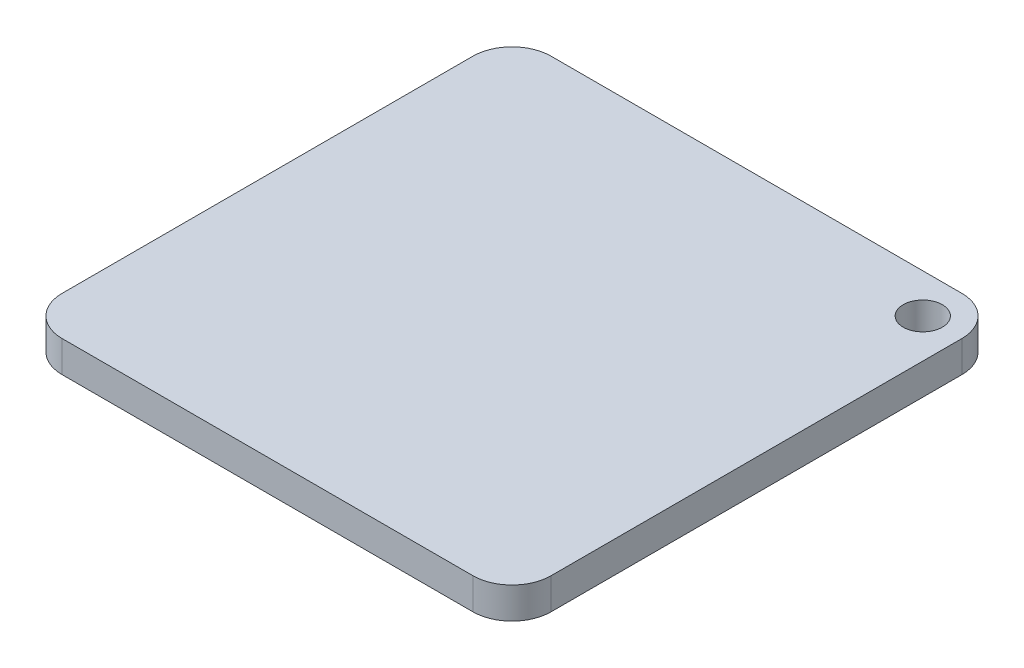
ISO-10303-21;
HEADER;
FILE_DESCRIPTION(('STEP AP214'),'2;1');
FILE_NAME('part.step','',(''),(''),'','','');
FILE_SCHEMA(('AUTOMOTIVE_DESIGN { 1 0 10303 214 1 1 1 1 }'));
ENDSEC;
DATA;
#1=APPLICATION_CONTEXT('core data for automotive mechanical design processes');
#2=APPLICATION_PROTOCOL_DEFINITION('international standard','automotive_design',2000,#1);
#3=PRODUCT_CONTEXT('',#1,'mechanical');
#4=PRODUCT('Part','Part','',(#3));
#5=PRODUCT_RELATED_PRODUCT_CATEGORY('part','',(#4));
#6=PRODUCT_DEFINITION_FORMATION('','',#4);
#7=PRODUCT_DEFINITION_CONTEXT('part definition',#1,'design');
#8=PRODUCT_DEFINITION('design','',#6,#7);
#9=PRODUCT_DEFINITION_SHAPE('','',#8);
#10=(LENGTH_UNIT() NAMED_UNIT(*) SI_UNIT(.MILLI.,.METRE.));
#11=(NAMED_UNIT(*) PLANE_ANGLE_UNIT() SI_UNIT($,.RADIAN.));
#12=(NAMED_UNIT(*) SI_UNIT($,.STERADIAN.) SOLID_ANGLE_UNIT());
#13=UNCERTAINTY_MEASURE_WITH_UNIT(LENGTH_MEASURE(1.E-05),#10,'distance_accuracy_value','');
#14=(GEOMETRIC_REPRESENTATION_CONTEXT(3) GLOBAL_UNCERTAINTY_ASSIGNED_CONTEXT((#13)) GLOBAL_UNIT_ASSIGNED_CONTEXT((#10,
#11,#12)) REPRESENTATION_CONTEXT('',''));
#15=CARTESIAN_POINT('',(0.,0.,0.));
#16=DIRECTION('',(0.,0.,1.));
#17=DIRECTION('',(1.,0.,0.));
#18=AXIS2_PLACEMENT_3D('',#15,#16,#17);
#19=CARTESIAN_POINT('',(-10.5,1.6,-10.5));
#20=DIRECTION('',(0.,1.,0.));
#21=DIRECTION('',(0.,0.,1.));
#22=AXIS2_PLACEMENT_3D('',#19,#20,#21);
#23=PLANE('',#22);
#24=CARTESIAN_POINT('',(-10.5,1.6,-10.5));
#25=DIRECTION('',(0.,1.,0.));
#26=DIRECTION('',(0.,0.,1.));
#27=AXIS2_PLACEMENT_3D('',#24,#25,#26);
#28=CIRCLE('',#27,2.);
#29=CARTESIAN_POINT('',(-10.5,1.6,-12.5));
#30=VERTEX_POINT('',#29);
#31=CARTESIAN_POINT('',(-12.5,1.6,-10.5));
#32=VERTEX_POINT('',#31);
#33=EDGE_CURVE('E164',#30,#32,#28,.T.);
#34=ORIENTED_EDGE('',*,*,#33,.T.);
#35=DIRECTION('',(0.,0.,1.));
#36=VECTOR('',#35,1.);
#37=CARTESIAN_POINT('',(-12.5,1.6,-10.5));
#38=LINE('',#37,#36);
#39=CARTESIAN_POINT('',(-12.5,1.6,10.5));
#40=VERTEX_POINT('',#39);
#41=EDGE_CURVE('E100',#32,#40,#38,.T.);
#42=ORIENTED_EDGE('',*,*,#41,.T.);
#43=CARTESIAN_POINT('',(-10.5,1.6,10.5));
#44=DIRECTION('',(0.,1.,0.));
#45=DIRECTION('',(0.,0.,1.));
#46=AXIS2_PLACEMENT_3D('',#43,#44,#45);
#47=CIRCLE('',#46,2.);
#48=CARTESIAN_POINT('',(-10.5,1.6,12.5));
#49=VERTEX_POINT('',#48);
#50=EDGE_CURVE('E185',#40,#49,#47,.T.);
#51=ORIENTED_EDGE('',*,*,#50,.T.);
#52=DIRECTION('',(1.,0.,0.));
#53=VECTOR('',#52,1.);
#54=CARTESIAN_POINT('',(-10.5,1.6,12.5));
#55=LINE('',#54,#53);
#56=CARTESIAN_POINT('',(10.5,1.6,12.5));
#57=VERTEX_POINT('',#56);
#58=EDGE_CURVE('E199',#49,#57,#55,.T.);
#59=ORIENTED_EDGE('',*,*,#58,.T.);
#60=CARTESIAN_POINT('',(10.5,1.6,10.5));
#61=DIRECTION('',(0.,1.,0.));
#62=DIRECTION('',(0.,0.,1.));
#63=AXIS2_PLACEMENT_3D('',#60,#61,#62);
#64=CIRCLE('',#63,2.);
#65=CARTESIAN_POINT('',(12.5,1.6,10.5));
#66=VERTEX_POINT('',#65);
#67=EDGE_CURVE('E119',#57,#66,#64,.T.);
#68=ORIENTED_EDGE('',*,*,#67,.T.);
#69=DIRECTION('',(0.,0.,-1.));
#70=VECTOR('',#69,1.);
#71=CARTESIAN_POINT('',(12.5,1.6,-10.5));
#72=LINE('',#71,#70);
#73=CARTESIAN_POINT('',(12.5,1.6,-10.5));
#74=VERTEX_POINT('',#73);
#75=EDGE_CURVE('E113',#66,#74,#72,.T.);
#76=ORIENTED_EDGE('',*,*,#75,.T.);
#77=CARTESIAN_POINT('',(10.5,1.6,-10.5));
#78=DIRECTION('',(0.,1.,0.));
#79=DIRECTION('',(0.,0.,1.));
#80=AXIS2_PLACEMENT_3D('',#77,#78,#79);
#81=CIRCLE('',#80,2.);
#82=CARTESIAN_POINT('',(10.5,1.6,-12.5));
#83=VERTEX_POINT('',#82);
#84=EDGE_CURVE('E117',#74,#83,#81,.T.);
#85=ORIENTED_EDGE('',*,*,#84,.T.);
#86=DIRECTION('',(-1.,0.,0.));
#87=VECTOR('',#86,1.);
#88=CARTESIAN_POINT('',(-10.5,1.6,-12.5));
#89=LINE('',#88,#87);
#90=EDGE_CURVE('E57',#83,#30,#89,.T.);
#91=ORIENTED_EDGE('',*,*,#90,.T.);
#92=EDGE_LOOP('',(#34,#42,#51,#59,#68,#76,#85,#91));
#93=FACE_BOUND('',#92,.T.);
#94=CARTESIAN_POINT('',(10.5,1.6,-10.5));
#95=DIRECTION('',(0.,1.,0.));
#96=DIRECTION('',(0.,0.,1.));
#97=AXIS2_PLACEMENT_3D('',#94,#95,#96);
#98=CIRCLE('',#97,1.);
#99=CARTESIAN_POINT('',(10.5,1.6,-9.5));
#100=VERTEX_POINT('',#99);
#101=EDGE_CURVE('E146',#100,#100,#98,.T.);
#102=ORIENTED_EDGE('',*,*,#101,.F.);
#103=EDGE_LOOP('',(#102));
#104=FACE_BOUND('',#103,.T.);
#105=ADVANCED_FACE('F39',(#93,#104),#23,.T.);
#106=CARTESIAN_POINT('',(-10.5,0.,-10.5));
#107=DIRECTION('',(0.,1.,0.));
#108=DIRECTION('',(0.,0.,1.));
#109=AXIS2_PLACEMENT_3D('',#106,#107,#108);
#110=PLANE('',#109);
#111=CARTESIAN_POINT('',(-10.5,0.,-10.5));
#112=DIRECTION('',(0.,1.,0.));
#113=DIRECTION('',(0.,0.,1.));
#114=AXIS2_PLACEMENT_3D('',#111,#112,#113);
#115=CIRCLE('',#114,2.);
#116=CARTESIAN_POINT('',(-10.5,0.,-12.5));
#117=VERTEX_POINT('',#116);
#118=CARTESIAN_POINT('',(-12.5,0.,-10.5));
#119=VERTEX_POINT('',#118);
#120=EDGE_CURVE('E141',#117,#119,#115,.T.);
#121=ORIENTED_EDGE('',*,*,#120,.F.);
#122=DIRECTION('',(-1.,0.,0.));
#123=VECTOR('',#122,1.);
#124=CARTESIAN_POINT('',(-10.5,0.,-12.5));
#125=LINE('',#124,#123);
#126=CARTESIAN_POINT('',(10.5,0.,-12.5));
#127=VERTEX_POINT('',#126);
#128=EDGE_CURVE('E92',#127,#117,#125,.T.);
#129=ORIENTED_EDGE('',*,*,#128,.F.);
#130=CARTESIAN_POINT('',(10.5,0.,-10.5));
#131=DIRECTION('',(0.,1.,0.));
#132=DIRECTION('',(0.,0.,1.));
#133=AXIS2_PLACEMENT_3D('',#130,#131,#132);
#134=CIRCLE('',#133,2.);
#135=CARTESIAN_POINT('',(12.5,0.,-10.5));
#136=VERTEX_POINT('',#135);
#137=EDGE_CURVE('E86',#136,#127,#134,.T.);
#138=ORIENTED_EDGE('',*,*,#137,.F.);
#139=DIRECTION('',(0.,0.,-1.));
#140=VECTOR('',#139,1.);
#141=CARTESIAN_POINT('',(12.5,0.,-10.5));
#142=LINE('',#141,#140);
#143=CARTESIAN_POINT('',(12.5,0.,10.5));
#144=VERTEX_POINT('',#143);
#145=EDGE_CURVE('E128',#144,#136,#142,.T.);
#146=ORIENTED_EDGE('',*,*,#145,.F.);
#147=CARTESIAN_POINT('',(10.5,0.,10.5));
#148=DIRECTION('',(0.,1.,0.));
#149=DIRECTION('',(0.,0.,1.));
#150=AXIS2_PLACEMENT_3D('',#147,#148,#149);
#151=CIRCLE('',#150,2.);
#152=CARTESIAN_POINT('',(10.5,0.,12.5));
#153=VERTEX_POINT('',#152);
#154=EDGE_CURVE('E155',#153,#144,#151,.T.);
#155=ORIENTED_EDGE('',*,*,#154,.F.);
#156=DIRECTION('',(1.,0.,0.));
#157=VECTOR('',#156,1.);
#158=CARTESIAN_POINT('',(-10.5,0.,12.5));
#159=LINE('',#158,#157);
#160=CARTESIAN_POINT('',(-10.5,0.,12.5));
#161=VERTEX_POINT('',#160);
#162=EDGE_CURVE('E152',#161,#153,#159,.T.);
#163=ORIENTED_EDGE('',*,*,#162,.F.);
#164=CARTESIAN_POINT('',(-10.5,0.,10.5));
#165=DIRECTION('',(0.,1.,0.));
#166=DIRECTION('',(0.,0.,1.));
#167=AXIS2_PLACEMENT_3D('',#164,#165,#166);
#168=CIRCLE('',#167,2.);
#169=CARTESIAN_POINT('',(-12.5,0.,10.5));
#170=VERTEX_POINT('',#169);
#171=EDGE_CURVE('E149',#170,#161,#168,.T.);
#172=ORIENTED_EDGE('',*,*,#171,.F.);
#173=DIRECTION('',(0.,0.,1.));
#174=VECTOR('',#173,1.);
#175=CARTESIAN_POINT('',(-12.5,0.,-10.5));
#176=LINE('',#175,#174);
#177=EDGE_CURVE('E145',#119,#170,#176,.T.);
#178=ORIENTED_EDGE('',*,*,#177,.F.);
#179=EDGE_LOOP('',(#121,#129,#138,#146,#155,#163,#172,#178));
#180=FACE_BOUND('',#179,.T.);
#181=CARTESIAN_POINT('',(10.5,0.,-10.5));
#182=DIRECTION('',(0.,1.,0.));
#183=DIRECTION('',(0.,0.,1.));
#184=AXIS2_PLACEMENT_3D('',#181,#182,#183);
#185=CIRCLE('',#184,1.);
#186=CARTESIAN_POINT('',(10.5,0.,-9.5));
#187=VERTEX_POINT('',#186);
#188=EDGE_CURVE('E209',#187,#187,#185,.T.);
#189=ORIENTED_EDGE('',*,*,#188,.T.);
#190=EDGE_LOOP('',(#189));
#191=FACE_BOUND('',#190,.T.);
#192=ADVANCED_FACE('F189',(#180,#191),#110,.F.);
#193=CARTESIAN_POINT('',(-10.5,1.6,-10.5));
#194=DIRECTION('',(0.,-1.,0.));
#195=DIRECTION('',(0.,0.,-1.));
#196=AXIS2_PLACEMENT_3D('',#193,#194,#195);
#197=CYLINDRICAL_SURFACE('',#196,2.);
#198=ORIENTED_EDGE('',*,*,#120,.T.);
#199=DIRECTION('',(0.,-1.,0.));
#200=VECTOR('',#199,1.);
#201=CARTESIAN_POINT('',(-12.5,1.6,-10.5));
#202=LINE('',#201,#200);
#203=EDGE_CURVE('E11',#32,#119,#202,.T.);
#204=ORIENTED_EDGE('',*,*,#203,.F.);
#205=ORIENTED_EDGE('',*,*,#33,.F.);
#206=DIRECTION('',(0.,-1.,0.));
#207=VECTOR('',#206,1.);
#208=CARTESIAN_POINT('',(-10.5,1.6,-12.5));
#209=LINE('',#208,#207);
#210=EDGE_CURVE('E137',#30,#117,#209,.T.);
#211=ORIENTED_EDGE('',*,*,#210,.T.);
#212=EDGE_LOOP('',(#198,#204,#205,#211));
#213=FACE_BOUND('',#212,.T.);
#214=ADVANCED_FACE('F41',(#213),#197,.T.);
#215=CARTESIAN_POINT('',(-12.5,1.6,-10.5));
#216=DIRECTION('',(1.,0.,0.));
#217=DIRECTION('',(0.,0.,-1.));
#218=AXIS2_PLACEMENT_3D('',#215,#216,#217);
#219=PLANE('',#218);
#220=ORIENTED_EDGE('',*,*,#177,.T.);
#221=DIRECTION('',(0.,-1.,0.));
#222=VECTOR('',#221,1.);
#223=CARTESIAN_POINT('',(-12.5,1.6,10.5));
#224=LINE('',#223,#222);
#225=EDGE_CURVE('E49',#40,#170,#224,.T.);
#226=ORIENTED_EDGE('',*,*,#225,.F.);
#227=ORIENTED_EDGE('',*,*,#41,.F.);
#228=ORIENTED_EDGE('',*,*,#203,.T.);
#229=EDGE_LOOP('',(#220,#226,#227,#228));
#230=FACE_BOUND('',#229,.T.);
#231=ADVANCED_FACE('F239',(#230),#219,.F.);
#232=CARTESIAN_POINT('',(-10.5,1.6,10.5));
#233=DIRECTION('',(0.,-1.,0.));
#234=DIRECTION('',(0.,0.,-1.));
#235=AXIS2_PLACEMENT_3D('',#232,#233,#234);
#236=CYLINDRICAL_SURFACE('',#235,2.);
#237=ORIENTED_EDGE('',*,*,#171,.T.);
#238=DIRECTION('',(0.,-1.,0.));
#239=VECTOR('',#238,1.);
#240=CARTESIAN_POINT('',(-10.5,1.6,12.5));
#241=LINE('',#240,#239);
#242=EDGE_CURVE('E175',#49,#161,#241,.T.);
#243=ORIENTED_EDGE('',*,*,#242,.F.);
#244=ORIENTED_EDGE('',*,*,#50,.F.);
#245=ORIENTED_EDGE('',*,*,#225,.T.);
#246=EDGE_LOOP('',(#237,#243,#244,#245));
#247=FACE_BOUND('',#246,.T.);
#248=ADVANCED_FACE('F183',(#247),#236,.T.);
#249=CARTESIAN_POINT('',(-10.5,1.6,12.5));
#250=DIRECTION('',(0.,0.,-1.));
#251=DIRECTION('',(-1.,0.,0.));
#252=AXIS2_PLACEMENT_3D('',#249,#250,#251);
#253=PLANE('',#252);
#254=ORIENTED_EDGE('',*,*,#162,.T.);
#255=DIRECTION('',(0.,-1.,0.));
#256=VECTOR('',#255,1.);
#257=CARTESIAN_POINT('',(10.5,1.6,12.5));
#258=LINE('',#257,#256);
#259=EDGE_CURVE('E171',#57,#153,#258,.T.);
#260=ORIENTED_EDGE('',*,*,#259,.F.);
#261=ORIENTED_EDGE('',*,*,#58,.F.);
#262=ORIENTED_EDGE('',*,*,#242,.T.);
#263=EDGE_LOOP('',(#254,#260,#261,#262));
#264=FACE_BOUND('',#263,.T.);
#265=ADVANCED_FACE('F194',(#264),#253,.F.);
#266=CARTESIAN_POINT('',(10.5,1.6,10.5));
#267=DIRECTION('',(0.,-1.,0.));
#268=DIRECTION('',(0.,0.,-1.));
#269=AXIS2_PLACEMENT_3D('',#266,#267,#268);
#270=CYLINDRICAL_SURFACE('',#269,2.);
#271=ORIENTED_EDGE('',*,*,#154,.T.);
#272=DIRECTION('',(0.,-1.,0.));
#273=VECTOR('',#272,1.);
#274=CARTESIAN_POINT('',(12.5,1.6,10.5));
#275=LINE('',#274,#273);
#276=EDGE_CURVE('E130',#66,#144,#275,.T.);
#277=ORIENTED_EDGE('',*,*,#276,.F.);
#278=ORIENTED_EDGE('',*,*,#67,.F.);
#279=ORIENTED_EDGE('',*,*,#259,.T.);
#280=EDGE_LOOP('',(#271,#277,#278,#279));
#281=FACE_BOUND('',#280,.T.);
#282=ADVANCED_FACE('F197',(#281),#270,.T.);
#283=CARTESIAN_POINT('',(12.5,1.6,-10.5));
#284=DIRECTION('',(-1.,0.,0.));
#285=DIRECTION('',(0.,0.,1.));
#286=AXIS2_PLACEMENT_3D('',#283,#284,#285);
#287=PLANE('',#286);
#288=ORIENTED_EDGE('',*,*,#145,.T.);
#289=DIRECTION('',(0.,-1.,0.));
#290=VECTOR('',#289,1.);
#291=CARTESIAN_POINT('',(12.5,1.6,-10.5));
#292=LINE('',#291,#290);
#293=EDGE_CURVE('E125',#74,#136,#292,.T.);
#294=ORIENTED_EDGE('',*,*,#293,.F.);
#295=ORIENTED_EDGE('',*,*,#75,.F.);
#296=ORIENTED_EDGE('',*,*,#276,.T.);
#297=EDGE_LOOP('',(#288,#294,#295,#296));
#298=FACE_BOUND('',#297,.T.);
#299=ADVANCED_FACE('F126',(#298),#287,.F.);
#300=CARTESIAN_POINT('',(10.5,1.6,-10.5));
#301=DIRECTION('',(0.,-1.,0.));
#302=DIRECTION('',(0.,0.,-1.));
#303=AXIS2_PLACEMENT_3D('',#300,#301,#302);
#304=CYLINDRICAL_SURFACE('',#303,2.);
#305=ORIENTED_EDGE('',*,*,#137,.T.);
#306=DIRECTION('',(0.,-1.,0.));
#307=VECTOR('',#306,1.);
#308=CARTESIAN_POINT('',(10.5,1.6,-12.5));
#309=LINE('',#308,#307);
#310=EDGE_CURVE('E131',#83,#127,#309,.T.);
#311=ORIENTED_EDGE('',*,*,#310,.F.);
#312=ORIENTED_EDGE('',*,*,#84,.F.);
#313=ORIENTED_EDGE('',*,*,#293,.T.);
#314=EDGE_LOOP('',(#305,#311,#312,#313));
#315=FACE_BOUND('',#314,.T.);
#316=ADVANCED_FACE('F133',(#315),#304,.T.);
#317=CARTESIAN_POINT('',(-10.5,1.6,-12.5));
#318=DIRECTION('',(0.,0.,1.));
#319=DIRECTION('',(1.,0.,0.));
#320=AXIS2_PLACEMENT_3D('',#317,#318,#319);
#321=PLANE('',#320);
#322=ORIENTED_EDGE('',*,*,#128,.T.);
#323=ORIENTED_EDGE('',*,*,#210,.F.);
#324=ORIENTED_EDGE('',*,*,#90,.F.);
#325=ORIENTED_EDGE('',*,*,#310,.T.);
#326=EDGE_LOOP('',(#322,#323,#324,#325));
#327=FACE_BOUND('',#326,.T.);
#328=ADVANCED_FACE('F227',(#327),#321,.F.);
#329=CARTESIAN_POINT('',(10.5,1.6,-10.5));
#330=DIRECTION('',(0.,-1.,0.));
#331=DIRECTION('',(0.,0.,-1.));
#332=AXIS2_PLACEMENT_3D('',#329,#330,#331);
#333=CYLINDRICAL_SURFACE('',#332,1.);
#334=ORIENTED_EDGE('',*,*,#101,.T.);
#335=EDGE_LOOP('',(#334));
#336=FACE_BOUND('',#335,.T.);
#337=ORIENTED_EDGE('',*,*,#188,.F.);
#338=EDGE_LOOP('',(#337));
#339=FACE_BOUND('',#338,.T.);
#340=ADVANCED_FACE('F217',(#336,#339),#333,.F.);
#341=CLOSED_SHELL('',(#105,#192,#214,#231,#248,#265,#282,#299,#316,#328,#340));
#342=MANIFOLD_SOLID_BREP('B2',#341);
#343=ADVANCED_BREP_SHAPE_REPRESENTATION('',(#18,#342),#14);
#344=SHAPE_DEFINITION_REPRESENTATION(#9,#343);
ENDSEC;
END-ISO-10303-21;
